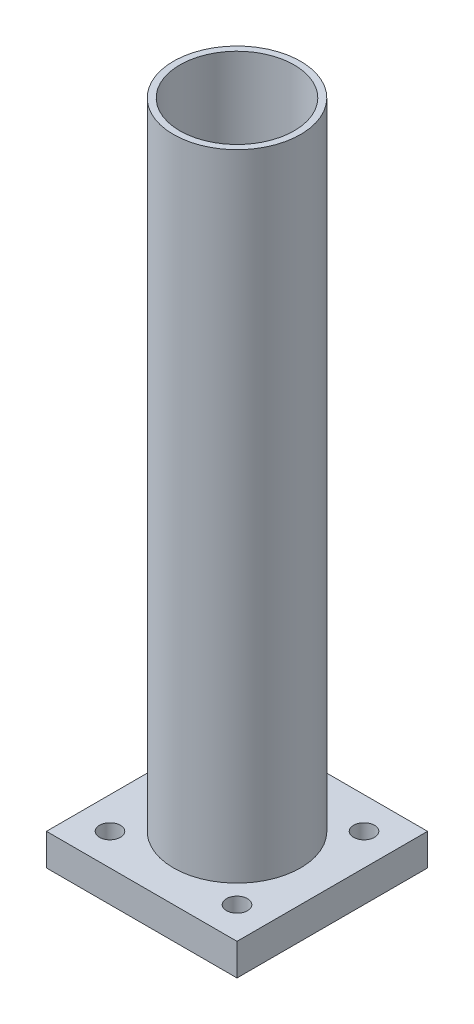
ISO-10303-21;
HEADER;
FILE_DESCRIPTION(('STEP AP214'),'2;1');
FILE_NAME('part.step','',(''),(''),'','','');
FILE_SCHEMA(('AUTOMOTIVE_DESIGN { 1 0 10303 214 1 1 1 1 }'));
ENDSEC;
DATA;
#1=APPLICATION_CONTEXT('core data for automotive mechanical design processes');
#2=APPLICATION_PROTOCOL_DEFINITION('international standard','automotive_design',2000,#1);
#3=PRODUCT_CONTEXT('',#1,'mechanical');
#4=PRODUCT('Part','Part','',(#3));
#5=PRODUCT_RELATED_PRODUCT_CATEGORY('part','',(#4));
#6=PRODUCT_DEFINITION_FORMATION('','',#4);
#7=PRODUCT_DEFINITION_CONTEXT('part definition',#1,'design');
#8=PRODUCT_DEFINITION('design','',#6,#7);
#9=PRODUCT_DEFINITION_SHAPE('','',#8);
#10=(LENGTH_UNIT() NAMED_UNIT(*) SI_UNIT(.MILLI.,.METRE.));
#11=(NAMED_UNIT(*) PLANE_ANGLE_UNIT() SI_UNIT($,.RADIAN.));
#12=(NAMED_UNIT(*) SI_UNIT($,.STERADIAN.) SOLID_ANGLE_UNIT());
#13=UNCERTAINTY_MEASURE_WITH_UNIT(LENGTH_MEASURE(1.E-05),#10,'distance_accuracy_value','');
#14=(GEOMETRIC_REPRESENTATION_CONTEXT(3) GLOBAL_UNCERTAINTY_ASSIGNED_CONTEXT((#13)) GLOBAL_UNIT_ASSIGNED_CONTEXT((#10,
#11,#12)) REPRESENTATION_CONTEXT('',''));
#15=CARTESIAN_POINT('',(0.,0.,0.));
#16=DIRECTION('',(0.,0.,1.));
#17=DIRECTION('',(1.,0.,0.));
#18=AXIS2_PLACEMENT_3D('',#15,#16,#17);
#19=CARTESIAN_POINT('',(-30.,-10.,30.));
#20=DIRECTION('',(-1.,0.,0.));
#21=DIRECTION('',(0.,0.,1.));
#22=AXIS2_PLACEMENT_3D('',#19,#20,#21);
#23=PLANE('',#22);
#24=DIRECTION('',(0.,0.,1.));
#25=VECTOR('',#24,1.);
#26=CARTESIAN_POINT('',(-30.,0.,30.));
#27=LINE('',#26,#25);
#28=CARTESIAN_POINT('',(-30.,0.,-30.));
#29=VERTEX_POINT('',#28);
#30=CARTESIAN_POINT('',(-30.,0.,30.));
#31=VERTEX_POINT('',#30);
#32=EDGE_CURVE('E107',#29,#31,#27,.T.);
#33=ORIENTED_EDGE('',*,*,#32,.F.);
#34=DIRECTION('',(0.,1.,0.));
#35=VECTOR('',#34,1.);
#36=CARTESIAN_POINT('',(-30.,-10.,-30.));
#37=LINE('',#36,#35);
#38=CARTESIAN_POINT('',(-30.,-10.,-30.));
#39=VERTEX_POINT('',#38);
#40=EDGE_CURVE('E12',#39,#29,#37,.T.);
#41=ORIENTED_EDGE('',*,*,#40,.F.);
#42=DIRECTION('',(0.,0.,1.));
#43=VECTOR('',#42,1.);
#44=CARTESIAN_POINT('',(-30.,-10.,30.));
#45=LINE('',#44,#43);
#46=CARTESIAN_POINT('',(-30.,-10.,30.));
#47=VERTEX_POINT('',#46);
#48=EDGE_CURVE('E100',#39,#47,#45,.T.);
#49=ORIENTED_EDGE('',*,*,#48,.T.);
#50=DIRECTION('',(0.,1.,0.));
#51=VECTOR('',#50,1.);
#52=CARTESIAN_POINT('',(-30.,-10.,30.));
#53=LINE('',#52,#51);
#54=EDGE_CURVE('E45',#47,#31,#53,.T.);
#55=ORIENTED_EDGE('',*,*,#54,.T.);
#56=EDGE_LOOP('',(#33,#41,#49,#55));
#57=FACE_BOUND('',#56,.T.);
#58=ADVANCED_FACE('F42',(#57),#23,.T.);
#59=CARTESIAN_POINT('',(30.,-10.,-30.));
#60=DIRECTION('',(0.,0.,-1.));
#61=DIRECTION('',(-1.,0.,0.));
#62=AXIS2_PLACEMENT_3D('',#59,#60,#61);
#63=PLANE('',#62);
#64=DIRECTION('',(-1.,0.,0.));
#65=VECTOR('',#64,1.);
#66=CARTESIAN_POINT('',(30.,0.,-30.));
#67=LINE('',#66,#65);
#68=CARTESIAN_POINT('',(30.,0.,-30.));
#69=VERTEX_POINT('',#68);
#70=EDGE_CURVE('E102',#69,#29,#67,.T.);
#71=ORIENTED_EDGE('',*,*,#70,.F.);
#72=DIRECTION('',(0.,1.,0.));
#73=VECTOR('',#72,1.);
#74=CARTESIAN_POINT('',(30.,-10.,-30.));
#75=LINE('',#74,#73);
#76=CARTESIAN_POINT('',(30.,-10.,-30.));
#77=VERTEX_POINT('',#76);
#78=EDGE_CURVE('E51',#77,#69,#75,.T.);
#79=ORIENTED_EDGE('',*,*,#78,.F.);
#80=DIRECTION('',(-1.,0.,0.));
#81=VECTOR('',#80,1.);
#82=CARTESIAN_POINT('',(30.,-10.,-30.));
#83=LINE('',#82,#81);
#84=EDGE_CURVE('E97',#77,#39,#83,.T.);
#85=ORIENTED_EDGE('',*,*,#84,.T.);
#86=ORIENTED_EDGE('',*,*,#40,.T.);
#87=EDGE_LOOP('',(#71,#79,#85,#86));
#88=FACE_BOUND('',#87,.T.);
#89=ADVANCED_FACE('F118',(#88),#63,.T.);
#90=CARTESIAN_POINT('',(30.,-10.,30.));
#91=DIRECTION('',(1.,0.,0.));
#92=DIRECTION('',(0.,0.,-1.));
#93=AXIS2_PLACEMENT_3D('',#90,#91,#92);
#94=PLANE('',#93);
#95=DIRECTION('',(0.,0.,-1.));
#96=VECTOR('',#95,1.);
#97=CARTESIAN_POINT('',(30.,0.,30.));
#98=LINE('',#97,#96);
#99=CARTESIAN_POINT('',(30.,0.,30.));
#100=VERTEX_POINT('',#99);
#101=EDGE_CURVE('E92',#100,#69,#98,.T.);
#102=ORIENTED_EDGE('',*,*,#101,.F.);
#103=DIRECTION('',(0.,1.,0.));
#104=VECTOR('',#103,1.);
#105=CARTESIAN_POINT('',(30.,-10.,30.));
#106=LINE('',#105,#104);
#107=CARTESIAN_POINT('',(30.,-10.,30.));
#108=VERTEX_POINT('',#107);
#109=EDGE_CURVE('E87',#108,#100,#106,.T.);
#110=ORIENTED_EDGE('',*,*,#109,.F.);
#111=DIRECTION('',(0.,0.,-1.));
#112=VECTOR('',#111,1.);
#113=CARTESIAN_POINT('',(30.,-10.,30.));
#114=LINE('',#113,#112);
#115=EDGE_CURVE('E90',#108,#77,#114,.T.);
#116=ORIENTED_EDGE('',*,*,#115,.T.);
#117=ORIENTED_EDGE('',*,*,#78,.T.);
#118=EDGE_LOOP('',(#102,#110,#116,#117));
#119=FACE_BOUND('',#118,.T.);
#120=ADVANCED_FACE('F89',(#119),#94,.T.);
#121=CARTESIAN_POINT('',(30.,-10.,30.));
#122=DIRECTION('',(0.,0.,1.));
#123=DIRECTION('',(1.,0.,0.));
#124=AXIS2_PLACEMENT_3D('',#121,#122,#123);
#125=PLANE('',#124);
#126=DIRECTION('',(1.,0.,0.));
#127=VECTOR('',#126,1.);
#128=CARTESIAN_POINT('',(30.,0.,30.));
#129=LINE('',#128,#127);
#130=EDGE_CURVE('E110',#31,#100,#129,.T.);
#131=ORIENTED_EDGE('',*,*,#130,.F.);
#132=ORIENTED_EDGE('',*,*,#54,.F.);
#133=DIRECTION('',(1.,0.,0.));
#134=VECTOR('',#133,1.);
#135=CARTESIAN_POINT('',(30.,-10.,30.));
#136=LINE('',#135,#134);
#137=EDGE_CURVE('E96',#47,#108,#136,.T.);
#138=ORIENTED_EDGE('',*,*,#137,.T.);
#139=ORIENTED_EDGE('',*,*,#109,.T.);
#140=EDGE_LOOP('',(#131,#132,#138,#139));
#141=FACE_BOUND('',#140,.T.);
#142=ADVANCED_FACE('F99',(#141),#125,.T.);
#143=CARTESIAN_POINT('',(0.,-10.,0.));
#144=DIRECTION('',(0.,1.,0.));
#145=DIRECTION('',(0.,0.,1.));
#146=AXIS2_PLACEMENT_3D('',#143,#144,#145);
#147=PLANE('',#146);
#148=CARTESIAN_POINT('',(20.,-9.99999999999999,-20.));
#149=DIRECTION('',(0.,1.,0.));
#150=DIRECTION('',(0.,0.,1.));
#151=AXIS2_PLACEMENT_3D('',#148,#149,#150);
#152=CIRCLE('',#151,3.29999999999999);
#153=CARTESIAN_POINT('',(20.,-9.99999999999999,-16.7));
#154=VERTEX_POINT('',#153);
#155=EDGE_CURVE('E159',#154,#154,#152,.T.);
#156=ORIENTED_EDGE('',*,*,#155,.T.);
#157=EDGE_LOOP('',(#156));
#158=FACE_BOUND('',#157,.T.);
#159=CARTESIAN_POINT('',(-20.,-9.99999999999999,-20.));
#160=DIRECTION('',(0.,1.,0.));
#161=DIRECTION('',(0.,0.,1.));
#162=AXIS2_PLACEMENT_3D('',#159,#160,#161);
#163=CIRCLE('',#162,3.29999999999999);
#164=CARTESIAN_POINT('',(-20.,-9.99999999999999,-16.7));
#165=VERTEX_POINT('',#164);
#166=EDGE_CURVE('E169',#165,#165,#163,.T.);
#167=ORIENTED_EDGE('',*,*,#166,.T.);
#168=EDGE_LOOP('',(#167));
#169=FACE_BOUND('',#168,.T.);
#170=CARTESIAN_POINT('',(-20.,-9.99999999999999,20.));
#171=DIRECTION('',(0.,1.,0.));
#172=DIRECTION('',(0.,0.,1.));
#173=AXIS2_PLACEMENT_3D('',#170,#171,#172);
#174=CIRCLE('',#173,3.29999999999999);
#175=CARTESIAN_POINT('',(-20.,-9.99999999999999,23.3));
#176=VERTEX_POINT('',#175);
#177=EDGE_CURVE('E175',#176,#176,#174,.T.);
#178=ORIENTED_EDGE('',*,*,#177,.T.);
#179=EDGE_LOOP('',(#178));
#180=FACE_BOUND('',#179,.T.);
#181=CARTESIAN_POINT('',(20.,-9.99999999999999,20.));
#182=DIRECTION('',(0.,1.,0.));
#183=DIRECTION('',(0.,0.,1.));
#184=AXIS2_PLACEMENT_3D('',#181,#182,#183);
#185=CIRCLE('',#184,3.29999999999999);
#186=CARTESIAN_POINT('',(20.,-9.99999999999999,23.3));
#187=VERTEX_POINT('',#186);
#188=EDGE_CURVE('E111',#187,#187,#185,.T.);
#189=ORIENTED_EDGE('',*,*,#188,.T.);
#190=EDGE_LOOP('',(#189));
#191=FACE_BOUND('',#190,.T.);
#192=ORIENTED_EDGE('',*,*,#48,.F.);
#193=ORIENTED_EDGE('',*,*,#84,.F.);
#194=ORIENTED_EDGE('',*,*,#115,.F.);
#195=ORIENTED_EDGE('',*,*,#137,.F.);
#196=EDGE_LOOP('',(#192,#193,#194,#195));
#197=FACE_BOUND('',#196,.T.);
#198=ADVANCED_FACE('F95',(#158,#169,#180,#191,#197),#147,.F.);
#199=CARTESIAN_POINT('',(0.,0.,0.));
#200=DIRECTION('',(0.,1.,0.));
#201=DIRECTION('',(0.,0.,1.));
#202=AXIS2_PLACEMENT_3D('',#199,#200,#201);
#203=PLANE('',#202);
#204=CARTESIAN_POINT('',(20.,0.,-20.));
#205=DIRECTION('',(0.,1.,0.));
#206=DIRECTION('',(0.,0.,1.));
#207=AXIS2_PLACEMENT_3D('',#204,#205,#206);
#208=CIRCLE('',#207,3.29999999999999);
#209=CARTESIAN_POINT('',(20.,0.,-16.7));
#210=VERTEX_POINT('',#209);
#211=EDGE_CURVE('E162',#210,#210,#208,.T.);
#212=ORIENTED_EDGE('',*,*,#211,.F.);
#213=EDGE_LOOP('',(#212));
#214=FACE_BOUND('',#213,.T.);
#215=CARTESIAN_POINT('',(-20.,0.,-20.));
#216=DIRECTION('',(0.,1.,0.));
#217=DIRECTION('',(0.,0.,1.));
#218=AXIS2_PLACEMENT_3D('',#215,#216,#217);
#219=CIRCLE('',#218,3.29999999999999);
#220=CARTESIAN_POINT('',(-20.,0.,-16.7));
#221=VERTEX_POINT('',#220);
#222=EDGE_CURVE('E164',#221,#221,#219,.T.);
#223=ORIENTED_EDGE('',*,*,#222,.F.);
#224=EDGE_LOOP('',(#223));
#225=FACE_BOUND('',#224,.T.);
#226=CARTESIAN_POINT('',(-20.,0.,20.));
#227=DIRECTION('',(0.,1.,0.));
#228=DIRECTION('',(0.,0.,1.));
#229=AXIS2_PLACEMENT_3D('',#226,#227,#228);
#230=CIRCLE('',#229,3.29999999999999);
#231=CARTESIAN_POINT('',(-20.,0.,23.3));
#232=VERTEX_POINT('',#231);
#233=EDGE_CURVE('E172',#232,#232,#230,.T.);
#234=ORIENTED_EDGE('',*,*,#233,.F.);
#235=EDGE_LOOP('',(#234));
#236=FACE_BOUND('',#235,.T.);
#237=CARTESIAN_POINT('',(20.,0.,20.));
#238=DIRECTION('',(0.,1.,0.));
#239=DIRECTION('',(0.,0.,1.));
#240=AXIS2_PLACEMENT_3D('',#237,#238,#239);
#241=CIRCLE('',#240,3.29999999999999);
#242=CARTESIAN_POINT('',(20.,0.,23.3));
#243=VERTEX_POINT('',#242);
#244=EDGE_CURVE('E178',#243,#243,#241,.T.);
#245=ORIENTED_EDGE('',*,*,#244,.F.);
#246=EDGE_LOOP('',(#245));
#247=FACE_BOUND('',#246,.T.);
#248=ORIENTED_EDGE('',*,*,#32,.T.);
#249=ORIENTED_EDGE('',*,*,#130,.T.);
#250=ORIENTED_EDGE('',*,*,#101,.T.);
#251=ORIENTED_EDGE('',*,*,#70,.T.);
#252=EDGE_LOOP('',(#248,#249,#250,#251));
#253=FACE_BOUND('',#252,.T.);
#254=ADVANCED_FACE('F117',(#214,#225,#236,#247,#253),#203,.T.);
#255=CARTESIAN_POINT('',(20.,0.,20.));
#256=DIRECTION('',(0.,1.,0.));
#257=DIRECTION('',(0.,0.,1.));
#258=AXIS2_PLACEMENT_3D('',#255,#256,#257);
#259=CYLINDRICAL_SURFACE('',#258,3.29999999999999);
#260=ORIENTED_EDGE('',*,*,#188,.F.);
#261=EDGE_LOOP('',(#260));
#262=FACE_BOUND('',#261,.T.);
#263=ORIENTED_EDGE('',*,*,#244,.T.);
#264=EDGE_LOOP('',(#263));
#265=FACE_BOUND('',#264,.T.);
#266=ADVANCED_FACE('F136',(#262,#265),#259,.F.);
#267=CARTESIAN_POINT('',(-20.,0.,20.));
#268=DIRECTION('',(0.,1.,0.));
#269=DIRECTION('',(0.,0.,1.));
#270=AXIS2_PLACEMENT_3D('',#267,#268,#269);
#271=CYLINDRICAL_SURFACE('',#270,3.29999999999999);
#272=ORIENTED_EDGE('',*,*,#177,.F.);
#273=EDGE_LOOP('',(#272));
#274=FACE_BOUND('',#273,.T.);
#275=ORIENTED_EDGE('',*,*,#233,.T.);
#276=EDGE_LOOP('',(#275));
#277=FACE_BOUND('',#276,.T.);
#278=ADVANCED_FACE('F143',(#274,#277),#271,.F.);
#279=CARTESIAN_POINT('',(-20.,0.,-20.));
#280=DIRECTION('',(0.,1.,0.));
#281=DIRECTION('',(0.,0.,1.));
#282=AXIS2_PLACEMENT_3D('',#279,#280,#281);
#283=CYLINDRICAL_SURFACE('',#282,3.29999999999999);
#284=ORIENTED_EDGE('',*,*,#166,.F.);
#285=EDGE_LOOP('',(#284));
#286=FACE_BOUND('',#285,.T.);
#287=ORIENTED_EDGE('',*,*,#222,.T.);
#288=EDGE_LOOP('',(#287));
#289=FACE_BOUND('',#288,.T.);
#290=ADVANCED_FACE('F147',(#286,#289),#283,.F.);
#291=CARTESIAN_POINT('',(20.,0.,-20.));
#292=DIRECTION('',(0.,1.,0.));
#293=DIRECTION('',(0.,0.,1.));
#294=AXIS2_PLACEMENT_3D('',#291,#292,#293);
#295=CYLINDRICAL_SURFACE('',#294,3.29999999999999);
#296=ORIENTED_EDGE('',*,*,#155,.F.);
#297=EDGE_LOOP('',(#296));
#298=FACE_BOUND('',#297,.T.);
#299=ORIENTED_EDGE('',*,*,#211,.T.);
#300=EDGE_LOOP('',(#299));
#301=FACE_BOUND('',#300,.T.);
#302=ADVANCED_FACE('F151',(#298,#301),#295,.F.);
#303=CLOSED_SHELL('',(#58,#89,#120,#142,#198,#254,#266,#278,#290,#302));
#304=MANIFOLD_SOLID_BREP('B2',#303);
#305=CARTESIAN_POINT('',(0.,200.,0.));
#306=DIRECTION('',(0.,1.,0.));
#307=DIRECTION('',(0.,0.,1.));
#308=AXIS2_PLACEMENT_3D('',#305,#306,#307);
#309=PLANE('',#308);
#310=CARTESIAN_POINT('',(0.,200.,0.));
#311=DIRECTION('',(0.,1.,0.));
#312=DIRECTION('',(0.,0.,1.));
#313=AXIS2_PLACEMENT_3D('',#310,#311,#312);
#314=CIRCLE('',#313,20.);
#315=CARTESIAN_POINT('',(0.,200.,20.));
#316=VERTEX_POINT('',#315);
#317=EDGE_CURVE('E41',#316,#316,#314,.T.);
#318=ORIENTED_EDGE('',*,*,#317,.T.);
#319=EDGE_LOOP('',(#318));
#320=FACE_BOUND('',#319,.T.);
#321=CARTESIAN_POINT('',(0.,200.,0.));
#322=DIRECTION('',(0.,1.,0.));
#323=DIRECTION('',(0.,0.,1.));
#324=AXIS2_PLACEMENT_3D('',#321,#322,#323);
#325=CIRCLE('',#324,18.);
#326=CARTESIAN_POINT('',(0.,200.,18.));
#327=VERTEX_POINT('',#326);
#328=EDGE_CURVE('E260',#327,#327,#325,.T.);
#329=ORIENTED_EDGE('',*,*,#328,.F.);
#330=EDGE_LOOP('',(#329));
#331=FACE_BOUND('',#330,.T.);
#332=ADVANCED_FACE('F249',(#320,#331),#309,.T.);
#333=CARTESIAN_POINT('',(0.,0.,0.));
#334=DIRECTION('',(0.,1.,0.));
#335=DIRECTION('',(0.,0.,1.));
#336=AXIS2_PLACEMENT_3D('',#333,#334,#335);
#337=PLANE('',#336);
#338=CARTESIAN_POINT('',(0.,0.,0.));
#339=DIRECTION('',(0.,1.,0.));
#340=DIRECTION('',(0.,0.,1.));
#341=AXIS2_PLACEMENT_3D('',#338,#339,#340);
#342=CIRCLE('',#341,20.);
#343=CARTESIAN_POINT('',(0.,0.,20.));
#344=VERTEX_POINT('',#343);
#345=EDGE_CURVE('E253',#344,#344,#342,.T.);
#346=ORIENTED_EDGE('',*,*,#345,.F.);
#347=EDGE_LOOP('',(#346));
#348=FACE_BOUND('',#347,.T.);
#349=CARTESIAN_POINT('',(0.,0.,0.));
#350=DIRECTION('',(0.,1.,0.));
#351=DIRECTION('',(0.,0.,1.));
#352=AXIS2_PLACEMENT_3D('',#349,#350,#351);
#353=CIRCLE('',#352,18.);
#354=CARTESIAN_POINT('',(0.,0.,18.));
#355=VERTEX_POINT('',#354);
#356=EDGE_CURVE('E262',#355,#355,#353,.T.);
#357=ORIENTED_EDGE('',*,*,#356,.T.);
#358=EDGE_LOOP('',(#357));
#359=FACE_BOUND('',#358,.T.);
#360=ADVANCED_FACE('F272',(#348,#359),#337,.F.);
#361=CARTESIAN_POINT('',(0.,200.,0.));
#362=DIRECTION('',(0.,-1.,0.));
#363=DIRECTION('',(0.,0.,-1.));
#364=AXIS2_PLACEMENT_3D('',#361,#362,#363);
#365=CYLINDRICAL_SURFACE('',#364,20.);
#366=ORIENTED_EDGE('',*,*,#317,.F.);
#367=EDGE_LOOP('',(#366));
#368=FACE_BOUND('',#367,.T.);
#369=ORIENTED_EDGE('',*,*,#345,.T.);
#370=EDGE_LOOP('',(#369));
#371=FACE_BOUND('',#370,.T.);
#372=ADVANCED_FACE('F251',(#368,#371),#365,.T.);
#373=CARTESIAN_POINT('',(0.,200.,0.));
#374=DIRECTION('',(0.,-1.,0.));
#375=DIRECTION('',(0.,0.,-1.));
#376=AXIS2_PLACEMENT_3D('',#373,#374,#375);
#377=CYLINDRICAL_SURFACE('',#376,18.);
#378=ORIENTED_EDGE('',*,*,#328,.T.);
#379=EDGE_LOOP('',(#378));
#380=FACE_BOUND('',#379,.T.);
#381=ORIENTED_EDGE('',*,*,#356,.F.);
#382=EDGE_LOOP('',(#381));
#383=FACE_BOUND('',#382,.T.);
#384=ADVANCED_FACE('F268',(#380,#383),#377,.F.);
#385=CLOSED_SHELL('',(#332,#360,#372,#384));
#386=MANIFOLD_SOLID_BREP('B6',#385);
#387=ADVANCED_BREP_SHAPE_REPRESENTATION('',(#18,#304,#386),#14);
#388=SHAPE_DEFINITION_REPRESENTATION(#9,#387);
ENDSEC;
END-ISO-10303-21;
